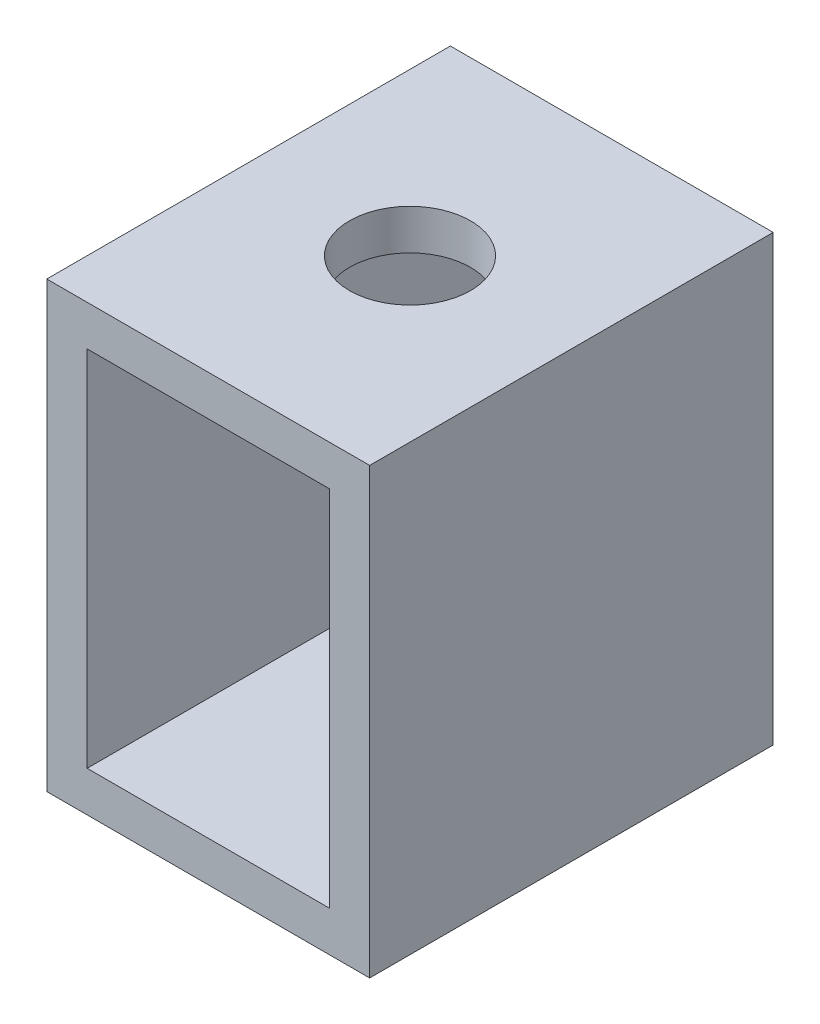
ISO-10303-21;
HEADER;
FILE_DESCRIPTION(('STEP AP214'),'2;1');
FILE_NAME('part.step','',(''),(''),'','','');
FILE_SCHEMA(('AUTOMOTIVE_DESIGN { 1 0 10303 214 1 1 1 1 }'));
ENDSEC;
DATA;
#1=APPLICATION_CONTEXT('core data for automotive mechanical design processes');
#2=APPLICATION_PROTOCOL_DEFINITION('international standard','automotive_design',2000,#1);
#3=PRODUCT_CONTEXT('',#1,'mechanical');
#4=PRODUCT('Part','Part','',(#3));
#5=PRODUCT_RELATED_PRODUCT_CATEGORY('part','',(#4));
#6=PRODUCT_DEFINITION_FORMATION('','',#4);
#7=PRODUCT_DEFINITION_CONTEXT('part definition',#1,'design');
#8=PRODUCT_DEFINITION('design','',#6,#7);
#9=PRODUCT_DEFINITION_SHAPE('','',#8);
#10=(LENGTH_UNIT() NAMED_UNIT(*) SI_UNIT(.MILLI.,.METRE.));
#11=(NAMED_UNIT(*) PLANE_ANGLE_UNIT() SI_UNIT($,.RADIAN.));
#12=(NAMED_UNIT(*) SI_UNIT($,.STERADIAN.) SOLID_ANGLE_UNIT());
#13=UNCERTAINTY_MEASURE_WITH_UNIT(LENGTH_MEASURE(1.E-05),#10,'distance_accuracy_value','');
#14=(GEOMETRIC_REPRESENTATION_CONTEXT(3) GLOBAL_UNCERTAINTY_ASSIGNED_CONTEXT((#13)) GLOBAL_UNIT_ASSIGNED_CONTEXT((#10,
#11,#12)) REPRESENTATION_CONTEXT('',''));
#15=CARTESIAN_POINT('',(0.,0.,0.));
#16=DIRECTION('',(0.,0.,1.));
#17=DIRECTION('',(1.,0.,0.));
#18=AXIS2_PLACEMENT_3D('',#15,#16,#17);
#19=CARTESIAN_POINT('',(0.,0.,5.));
#20=DIRECTION('',(0.,0.,1.));
#21=DIRECTION('',(1.,0.,0.));
#22=AXIS2_PLACEMENT_3D('',#19,#20,#21);
#23=PLANE('',#22);
#24=DIRECTION('',(0.,-1.,0.));
#25=VECTOR('',#24,1.);
#26=CARTESIAN_POINT('',(-0.5,0.,5.));
#27=LINE('',#26,#25);
#28=CARTESIAN_POINT('',(-0.5,5.,5.));
#29=VERTEX_POINT('',#28);
#30=CARTESIAN_POINT('',(-0.5,-0.5,5.));
#31=VERTEX_POINT('',#30);
#32=EDGE_CURVE('E159',#29,#31,#27,.T.);
#33=ORIENTED_EDGE('',*,*,#32,.T.);
#34=DIRECTION('',(1.,0.,0.));
#35=VECTOR('',#34,1.);
#36=CARTESIAN_POINT('',(0.,-0.5,5.));
#37=LINE('',#36,#35);
#38=CARTESIAN_POINT('',(3.5,-0.5,5.));
#39=VERTEX_POINT('',#38);
#40=EDGE_CURVE('E162',#31,#39,#37,.T.);
#41=ORIENTED_EDGE('',*,*,#40,.T.);
#42=DIRECTION('',(0.,1.,0.));
#43=VECTOR('',#42,1.);
#44=CARTESIAN_POINT('',(3.5,0.,5.));
#45=LINE('',#44,#43);
#46=CARTESIAN_POINT('',(3.5,5.,5.));
#47=VERTEX_POINT('',#46);
#48=EDGE_CURVE('E165',#39,#47,#45,.T.);
#49=ORIENTED_EDGE('',*,*,#48,.T.);
#50=DIRECTION('',(-1.,0.,0.));
#51=VECTOR('',#50,1.);
#52=CARTESIAN_POINT('',(0.,5.,5.));
#53=LINE('',#52,#51);
#54=EDGE_CURVE('E167',#47,#29,#53,.T.);
#55=ORIENTED_EDGE('',*,*,#54,.T.);
#56=EDGE_LOOP('',(#33,#41,#49,#55));
#57=FACE_BOUND('',#56,.T.);
#58=DIRECTION('',(1.,0.,0.));
#59=VECTOR('',#58,1.);
#60=CARTESIAN_POINT('',(0.,0.,5.));
#61=LINE('',#60,#59);
#62=CARTESIAN_POINT('',(0.,0.,5.));
#63=VERTEX_POINT('',#62);
#64=CARTESIAN_POINT('',(3.,0.,5.));
#65=VERTEX_POINT('',#64);
#66=EDGE_CURVE('E129',#63,#65,#61,.T.);
#67=ORIENTED_EDGE('',*,*,#66,.F.);
#68=DIRECTION('',(0.,-1.,0.));
#69=VECTOR('',#68,1.);
#70=CARTESIAN_POINT('',(0.,0.,5.));
#71=LINE('',#70,#69);
#72=CARTESIAN_POINT('',(0.,4.5,5.));
#73=VERTEX_POINT('',#72);
#74=EDGE_CURVE('E121',#73,#63,#71,.T.);
#75=ORIENTED_EDGE('',*,*,#74,.F.);
#76=DIRECTION('',(-1.,0.,0.));
#77=VECTOR('',#76,1.);
#78=CARTESIAN_POINT('',(0.,4.5,5.));
#79=LINE('',#78,#77);
#80=CARTESIAN_POINT('',(3.,4.5,5.));
#81=VERTEX_POINT('',#80);
#82=EDGE_CURVE('E143',#81,#73,#79,.T.);
#83=ORIENTED_EDGE('',*,*,#82,.F.);
#84=DIRECTION('',(0.,1.,0.));
#85=VECTOR('',#84,1.);
#86=CARTESIAN_POINT('',(3.,0.,5.));
#87=LINE('',#86,#85);
#88=EDGE_CURVE('E141',#65,#81,#87,.T.);
#89=ORIENTED_EDGE('',*,*,#88,.F.);
#90=EDGE_LOOP('',(#67,#75,#83,#89));
#91=FACE_BOUND('',#90,.T.);
#92=ADVANCED_FACE('F56',(#57,#91),#23,.T.);
#93=CARTESIAN_POINT('',(0.,0.,0.));
#94=DIRECTION('',(0.,0.,1.));
#95=DIRECTION('',(1.,0.,0.));
#96=AXIS2_PLACEMENT_3D('',#93,#94,#95);
#97=PLANE('',#96);
#98=DIRECTION('',(0.,-1.,0.));
#99=VECTOR('',#98,1.);
#100=CARTESIAN_POINT('',(-0.5,0.,0.));
#101=LINE('',#100,#99);
#102=CARTESIAN_POINT('',(-0.5,5.,0.));
#103=VERTEX_POINT('',#102);
#104=CARTESIAN_POINT('',(-0.5,-0.5,0.));
#105=VERTEX_POINT('',#104);
#106=EDGE_CURVE('E137',#103,#105,#101,.T.);
#107=ORIENTED_EDGE('',*,*,#106,.F.);
#108=DIRECTION('',(-1.,0.,0.));
#109=VECTOR('',#108,1.);
#110=CARTESIAN_POINT('',(0.,5.,0.));
#111=LINE('',#110,#109);
#112=CARTESIAN_POINT('',(3.5,5.,0.));
#113=VERTEX_POINT('',#112);
#114=EDGE_CURVE('E163',#113,#103,#111,.T.);
#115=ORIENTED_EDGE('',*,*,#114,.F.);
#116=DIRECTION('',(0.,1.,0.));
#117=VECTOR('',#116,1.);
#118=CARTESIAN_POINT('',(3.5,0.,0.));
#119=LINE('',#118,#117);
#120=CARTESIAN_POINT('',(3.5,-0.5,0.));
#121=VERTEX_POINT('',#120);
#122=EDGE_CURVE('E174',#121,#113,#119,.T.);
#123=ORIENTED_EDGE('',*,*,#122,.F.);
#124=DIRECTION('',(1.,0.,0.));
#125=VECTOR('',#124,1.);
#126=CARTESIAN_POINT('',(0.,-0.5,0.));
#127=LINE('',#126,#125);
#128=EDGE_CURVE('E172',#105,#121,#127,.T.);
#129=ORIENTED_EDGE('',*,*,#128,.F.);
#130=EDGE_LOOP('',(#107,#115,#123,#129));
#131=FACE_BOUND('',#130,.T.);
#132=DIRECTION('',(0.,-1.,0.));
#133=VECTOR('',#132,1.);
#134=CARTESIAN_POINT('',(0.,0.,0.));
#135=LINE('',#134,#133);
#136=CARTESIAN_POINT('',(0.,4.5,0.));
#137=VERTEX_POINT('',#136);
#138=CARTESIAN_POINT('',(0.,0.,0.));
#139=VERTEX_POINT('',#138);
#140=EDGE_CURVE('E79',#137,#139,#135,.T.);
#141=ORIENTED_EDGE('',*,*,#140,.T.);
#142=DIRECTION('',(1.,0.,0.));
#143=VECTOR('',#142,1.);
#144=CARTESIAN_POINT('',(0.,0.,0.));
#145=LINE('',#144,#143);
#146=CARTESIAN_POINT('',(3.,0.,0.));
#147=VERTEX_POINT('',#146);
#148=EDGE_CURVE('E136',#139,#147,#145,.T.);
#149=ORIENTED_EDGE('',*,*,#148,.T.);
#150=DIRECTION('',(0.,1.,0.));
#151=VECTOR('',#150,1.);
#152=CARTESIAN_POINT('',(3.,0.,0.));
#153=LINE('',#152,#151);
#154=CARTESIAN_POINT('',(3.,4.5,0.));
#155=VERTEX_POINT('',#154);
#156=EDGE_CURVE('E151',#147,#155,#153,.T.);
#157=ORIENTED_EDGE('',*,*,#156,.T.);
#158=DIRECTION('',(-1.,0.,0.));
#159=VECTOR('',#158,1.);
#160=CARTESIAN_POINT('',(0.,4.5,0.));
#161=LINE('',#160,#159);
#162=EDGE_CURVE('E130',#155,#137,#161,.T.);
#163=ORIENTED_EDGE('',*,*,#162,.T.);
#164=EDGE_LOOP('',(#141,#149,#157,#163));
#165=FACE_BOUND('',#164,.T.);
#166=ADVANCED_FACE('F192',(#131,#165),#97,.F.);
#167=CARTESIAN_POINT('',(-0.5,0.,5.));
#168=DIRECTION('',(1.,0.,0.));
#169=DIRECTION('',(0.,0.,-1.));
#170=AXIS2_PLACEMENT_3D('',#167,#168,#169);
#171=PLANE('',#170);
#172=ORIENTED_EDGE('',*,*,#106,.T.);
#173=DIRECTION('',(0.,0.,-1.));
#174=VECTOR('',#173,1.);
#175=CARTESIAN_POINT('',(-0.5,-0.5,5.));
#176=LINE('',#175,#174);
#177=EDGE_CURVE('E12',#31,#105,#176,.T.);
#178=ORIENTED_EDGE('',*,*,#177,.F.);
#179=ORIENTED_EDGE('',*,*,#32,.F.);
#180=DIRECTION('',(0.,0.,-1.));
#181=VECTOR('',#180,1.);
#182=CARTESIAN_POINT('',(-0.5,5.,5.));
#183=LINE('',#182,#181);
#184=EDGE_CURVE('E169',#29,#103,#183,.T.);
#185=ORIENTED_EDGE('',*,*,#184,.T.);
#186=EDGE_LOOP('',(#172,#178,#179,#185));
#187=FACE_BOUND('',#186,.T.);
#188=ADVANCED_FACE('F58',(#187),#171,.F.);
#189=CARTESIAN_POINT('',(0.,-0.5,5.));
#190=DIRECTION('',(0.,1.,0.));
#191=DIRECTION('',(0.,0.,1.));
#192=AXIS2_PLACEMENT_3D('',#189,#190,#191);
#193=PLANE('',#192);
#194=ORIENTED_EDGE('',*,*,#128,.T.);
#195=DIRECTION('',(0.,0.,-1.));
#196=VECTOR('',#195,1.);
#197=CARTESIAN_POINT('',(3.5,-0.5,5.));
#198=LINE('',#197,#196);
#199=EDGE_CURVE('E64',#39,#121,#198,.T.);
#200=ORIENTED_EDGE('',*,*,#199,.F.);
#201=ORIENTED_EDGE('',*,*,#40,.F.);
#202=ORIENTED_EDGE('',*,*,#177,.T.);
#203=EDGE_LOOP('',(#194,#200,#201,#202));
#204=FACE_BOUND('',#203,.T.);
#205=ADVANCED_FACE('F202',(#204),#193,.F.);
#206=CARTESIAN_POINT('',(3.5,0.,5.));
#207=DIRECTION('',(-1.,0.,0.));
#208=DIRECTION('',(0.,0.,1.));
#209=AXIS2_PLACEMENT_3D('',#206,#207,#208);
#210=PLANE('',#209);
#211=ORIENTED_EDGE('',*,*,#122,.T.);
#212=DIRECTION('',(0.,0.,-1.));
#213=VECTOR('',#212,1.);
#214=CARTESIAN_POINT('',(3.5,5.,5.));
#215=LINE('',#214,#213);
#216=EDGE_CURVE('E179',#47,#113,#215,.T.);
#217=ORIENTED_EDGE('',*,*,#216,.F.);
#218=ORIENTED_EDGE('',*,*,#48,.F.);
#219=ORIENTED_EDGE('',*,*,#199,.T.);
#220=EDGE_LOOP('',(#211,#217,#218,#219));
#221=FACE_BOUND('',#220,.T.);
#222=ADVANCED_FACE('F186',(#221),#210,.F.);
#223=CARTESIAN_POINT('',(0.,5.,5.));
#224=DIRECTION('',(0.,-1.,0.));
#225=DIRECTION('',(0.,0.,-1.));
#226=AXIS2_PLACEMENT_3D('',#223,#224,#225);
#227=PLANE('',#226);
#228=CARTESIAN_POINT('',(1.5,5.,2.5));
#229=DIRECTION('',(0.,1.,0.));
#230=DIRECTION('',(0.,0.,1.));
#231=AXIS2_PLACEMENT_3D('',#228,#229,#230);
#232=CIRCLE('',#231,0.75);
#233=CARTESIAN_POINT('',(1.5,5.,3.25));
#234=VERTEX_POINT('',#233);
#235=EDGE_CURVE('E149',#234,#234,#232,.T.);
#236=ORIENTED_EDGE('',*,*,#235,.F.);
#237=EDGE_LOOP('',(#236));
#238=FACE_BOUND('',#237,.T.);
#239=ORIENTED_EDGE('',*,*,#114,.T.);
#240=ORIENTED_EDGE('',*,*,#184,.F.);
#241=ORIENTED_EDGE('',*,*,#54,.F.);
#242=ORIENTED_EDGE('',*,*,#216,.T.);
#243=EDGE_LOOP('',(#239,#240,#241,#242));
#244=FACE_BOUND('',#243,.T.);
#245=ADVANCED_FACE('F196',(#238,#244),#227,.F.);
#246=CARTESIAN_POINT('',(0.,0.,5.));
#247=DIRECTION('',(1.,0.,0.));
#248=DIRECTION('',(0.,0.,-1.));
#249=AXIS2_PLACEMENT_3D('',#246,#247,#248);
#250=PLANE('',#249);
#251=ORIENTED_EDGE('',*,*,#140,.F.);
#252=DIRECTION('',(0.,0.,-1.));
#253=VECTOR('',#252,1.);
#254=CARTESIAN_POINT('',(0.,4.5,5.));
#255=LINE('',#254,#253);
#256=EDGE_CURVE('E125',#73,#137,#255,.T.);
#257=ORIENTED_EDGE('',*,*,#256,.F.);
#258=ORIENTED_EDGE('',*,*,#74,.T.);
#259=DIRECTION('',(0.,0.,-1.));
#260=VECTOR('',#259,1.);
#261=CARTESIAN_POINT('',(0.,0.,5.));
#262=LINE('',#261,#260);
#263=EDGE_CURVE('E124',#63,#139,#262,.T.);
#264=ORIENTED_EDGE('',*,*,#263,.T.);
#265=EDGE_LOOP('',(#251,#257,#258,#264));
#266=FACE_BOUND('',#265,.T.);
#267=ADVANCED_FACE('F123',(#266),#250,.T.);
#268=CARTESIAN_POINT('',(0.,0.,5.));
#269=DIRECTION('',(0.,1.,0.));
#270=DIRECTION('',(0.,0.,1.));
#271=AXIS2_PLACEMENT_3D('',#268,#269,#270);
#272=PLANE('',#271);
#273=ORIENTED_EDGE('',*,*,#148,.F.);
#274=ORIENTED_EDGE('',*,*,#263,.F.);
#275=ORIENTED_EDGE('',*,*,#66,.T.);
#276=DIRECTION('',(0.,0.,-1.));
#277=VECTOR('',#276,1.);
#278=CARTESIAN_POINT('',(3.,0.,5.));
#279=LINE('',#278,#277);
#280=EDGE_CURVE('E138',#65,#147,#279,.T.);
#281=ORIENTED_EDGE('',*,*,#280,.T.);
#282=EDGE_LOOP('',(#273,#274,#275,#281));
#283=FACE_BOUND('',#282,.T.);
#284=ADVANCED_FACE('F133',(#283),#272,.T.);
#285=CARTESIAN_POINT('',(3.,0.,5.));
#286=DIRECTION('',(-1.,0.,0.));
#287=DIRECTION('',(0.,0.,1.));
#288=AXIS2_PLACEMENT_3D('',#285,#286,#287);
#289=PLANE('',#288);
#290=ORIENTED_EDGE('',*,*,#156,.F.);
#291=ORIENTED_EDGE('',*,*,#280,.F.);
#292=ORIENTED_EDGE('',*,*,#88,.T.);
#293=DIRECTION('',(0.,0.,-1.));
#294=VECTOR('',#293,1.);
#295=CARTESIAN_POINT('',(3.,4.5,5.));
#296=LINE('',#295,#294);
#297=EDGE_CURVE('E71',#81,#155,#296,.T.);
#298=ORIENTED_EDGE('',*,*,#297,.T.);
#299=EDGE_LOOP('',(#290,#291,#292,#298));
#300=FACE_BOUND('',#299,.T.);
#301=ADVANCED_FACE('F239',(#300),#289,.T.);
#302=CARTESIAN_POINT('',(0.,4.5,5.));
#303=DIRECTION('',(0.,-1.,0.));
#304=DIRECTION('',(0.,0.,-1.));
#305=AXIS2_PLACEMENT_3D('',#302,#303,#304);
#306=PLANE('',#305);
#307=CARTESIAN_POINT('',(1.5,4.5,2.5));
#308=DIRECTION('',(0.,-1.,0.));
#309=DIRECTION('',(0.,0.,-1.));
#310=AXIS2_PLACEMENT_3D('',#307,#308,#309);
#311=CIRCLE('',#310,0.75);
#312=CARTESIAN_POINT('',(1.5,4.5,3.25));
#313=VERTEX_POINT('',#312);
#314=EDGE_CURVE('E226',#313,#313,#311,.F.);
#315=ORIENTED_EDGE('',*,*,#314,.T.);
#316=EDGE_LOOP('',(#315));
#317=FACE_BOUND('',#316,.T.);
#318=ORIENTED_EDGE('',*,*,#162,.F.);
#319=ORIENTED_EDGE('',*,*,#297,.F.);
#320=ORIENTED_EDGE('',*,*,#82,.T.);
#321=ORIENTED_EDGE('',*,*,#256,.T.);
#322=EDGE_LOOP('',(#318,#319,#320,#321));
#323=FACE_BOUND('',#322,.T.);
#324=ADVANCED_FACE('F231',(#317,#323),#306,.T.);
#325=CARTESIAN_POINT('',(1.5,-0.501,2.5));
#326=DIRECTION('',(0.,1.,0.));
#327=DIRECTION('',(0.,0.,1.));
#328=AXIS2_PLACEMENT_3D('',#325,#326,#327);
#329=CYLINDRICAL_SURFACE('',#328,0.75);
#330=CARTESIAN_POINT('',(1.5,4.5,3.25));
#331=CARTESIAN_POINT('',(1.5,4.50520833333333,3.25));
#332=CARTESIAN_POINT('',(1.5,4.51041666666667,3.25));
#333=CARTESIAN_POINT('',(1.5,4.52083333333333,3.25));
#334=CARTESIAN_POINT('',(1.5,4.52604166666667,3.25));
#335=CARTESIAN_POINT('',(1.5,4.53645833333333,3.25));
#336=CARTESIAN_POINT('',(1.5,4.54166666666667,3.25));
#337=CARTESIAN_POINT('',(1.5,4.55208333333333,3.25));
#338=CARTESIAN_POINT('',(1.5,4.55729166666667,3.25));
#339=CARTESIAN_POINT('',(1.5,4.56770833333333,3.25));
#340=CARTESIAN_POINT('',(1.5,4.57291666666667,3.25));
#341=CARTESIAN_POINT('',(1.5,4.58333333333333,3.25));
#342=CARTESIAN_POINT('',(1.5,4.58854166666667,3.25));
#343=CARTESIAN_POINT('',(1.5,4.59895833333333,3.25));
#344=CARTESIAN_POINT('',(1.5,4.60416666666667,3.25));
#345=CARTESIAN_POINT('',(1.5,4.61458333333333,3.25));
#346=CARTESIAN_POINT('',(1.5,4.61979166666667,3.25));
#347=CARTESIAN_POINT('',(1.5,4.63020833333333,3.25));
#348=CARTESIAN_POINT('',(1.5,4.63541666666667,3.25));
#349=CARTESIAN_POINT('',(1.5,4.64583333333333,3.25));
#350=CARTESIAN_POINT('',(1.5,4.65104166666667,3.25));
#351=CARTESIAN_POINT('',(1.5,4.66145833333333,3.25));
#352=CARTESIAN_POINT('',(1.5,4.66666666666667,3.25));
#353=CARTESIAN_POINT('',(1.5,4.67708333333333,3.25));
#354=CARTESIAN_POINT('',(1.5,4.68229166666667,3.25));
#355=CARTESIAN_POINT('',(1.5,4.69270833333333,3.25));
#356=CARTESIAN_POINT('',(1.5,4.69791666666667,3.25));
#357=CARTESIAN_POINT('',(1.5,4.70833333333333,3.25));
#358=CARTESIAN_POINT('',(1.5,4.71354166666667,3.25));
#359=CARTESIAN_POINT('',(1.5,4.72395833333333,3.25));
#360=CARTESIAN_POINT('',(1.5,4.72916666666667,3.25));
#361=CARTESIAN_POINT('',(1.5,4.73958333333333,3.25));
#362=CARTESIAN_POINT('',(1.5,4.74479166666667,3.25));
#363=CARTESIAN_POINT('',(1.5,4.75520833333333,3.25));
#364=CARTESIAN_POINT('',(1.5,4.76041666666667,3.25));
#365=CARTESIAN_POINT('',(1.5,4.77083333333333,3.25));
#366=CARTESIAN_POINT('',(1.5,4.77604166666667,3.25));
#367=CARTESIAN_POINT('',(1.5,4.78645833333333,3.25));
#368=CARTESIAN_POINT('',(1.5,4.79166666666667,3.25));
#369=CARTESIAN_POINT('',(1.5,4.80208333333333,3.25));
#370=CARTESIAN_POINT('',(1.5,4.80729166666667,3.25));
#371=CARTESIAN_POINT('',(1.5,4.81770833333333,3.25));
#372=CARTESIAN_POINT('',(1.5,4.82291666666667,3.25));
#373=CARTESIAN_POINT('',(1.5,4.83333333333333,3.25));
#374=CARTESIAN_POINT('',(1.5,4.83854166666667,3.25));
#375=CARTESIAN_POINT('',(1.5,4.84895833333333,3.25));
#376=CARTESIAN_POINT('',(1.5,4.85416666666667,3.25));
#377=CARTESIAN_POINT('',(1.5,4.86458333333333,3.25));
#378=CARTESIAN_POINT('',(1.5,4.86979166666667,3.25));
#379=CARTESIAN_POINT('',(1.5,4.88020833333333,3.25));
#380=CARTESIAN_POINT('',(1.5,4.88541666666666,3.25));
#381=CARTESIAN_POINT('',(1.5,4.89583333333333,3.25));
#382=CARTESIAN_POINT('',(1.5,4.90104166666666,3.25));
#383=CARTESIAN_POINT('',(1.5,4.91145833333333,3.25));
#384=CARTESIAN_POINT('',(1.5,4.91666666666666,3.25));
#385=CARTESIAN_POINT('',(1.5,4.92708333333333,3.25));
#386=CARTESIAN_POINT('',(1.5,4.93229166666666,3.25));
#387=CARTESIAN_POINT('',(1.5,4.94270833333333,3.25));
#388=CARTESIAN_POINT('',(1.5,4.94791666666666,3.25));
#389=CARTESIAN_POINT('',(1.5,4.95833333333333,3.25));
#390=CARTESIAN_POINT('',(1.5,4.96354166666666,3.25));
#391=CARTESIAN_POINT('',(1.5,4.97395833333333,3.25));
#392=CARTESIAN_POINT('',(1.5,4.97916666666666,3.25));
#393=CARTESIAN_POINT('',(1.5,4.98958333333333,3.25));
#394=CARTESIAN_POINT('',(1.5,4.99479166666666,3.25));
#395=CARTESIAN_POINT('',(1.5,5.,3.25));
#396=B_SPLINE_CURVE_WITH_KNOTS('',3,(#330,#331,#332,#333,#334,#335,#336,#337,#338,#339,#340,
#341,#342,#343,#344,#345,#346,#347,#348,#349,#350,#351,#352,#353,#354,#355,#356,#357,#358,#359,
#360,#361,#362,#363,#364,#365,#366,#367,#368,#369,#370,#371,#372,#373,#374,#375,#376,#377,#378,
#379,#380,#381,#382,#383,#384,#385,#386,#387,#388,#389,#390,#391,#392,#393,#394,#395),
.UNSPECIFIED.,.F.,.F.,(4,2,2,2,2,2,2,2,2,2,2,2,2,2,2,2,2,2,2,2,2,2,2,2,2,2,2,2,2,2,2,2,4),(0.,
0.015625,0.03125,0.046875,0.0625000000000001,0.0781250000000001,0.0937500000000001,0.109375,
0.125,0.140624999999999,0.156249999999999,0.171874999999999,0.187499999999999,0.203124999999999,
0.218749999999999,0.234374999999999,0.249999999999999,0.265624999999999,0.281249999999999,
0.296874999999999,0.312499999999999,0.328124999999999,0.343749999999999,0.359374999999999,
0.374999999999999,0.390624999999999,0.406249999999999,0.421874999999999,0.437499999999999,
0.453124999999999,0.468749999999999,0.484374999999999,0.499999999999999),.UNSPECIFIED.);
#397=EDGE_CURVE('BSEAM233',#313,#234,#396,.T.);
#398=ORIENTED_EDGE('',*,*,#314,.F.);
#399=ORIENTED_EDGE('',*,*,#235,.T.);
#400=ORIENTED_EDGE('',*,*,#397,.T.);
#401=ORIENTED_EDGE('',*,*,#397,.F.);
#402=EDGE_LOOP('',(#398,#400,#399,#401));
#403=FACE_BOUND('',#402,.T.);
#404=ADVANCED_FACE('F233',(#403),#329,.F.);
#405=CLOSED_SHELL('',(#92,#166,#188,#205,#222,#245,#267,#284,#301,#324,#404));
#406=MANIFOLD_SOLID_BREP('B2',#405);
#407=ADVANCED_BREP_SHAPE_REPRESENTATION('',(#18,#406),#14);
#408=SHAPE_DEFINITION_REPRESENTATION(#9,#407);
ENDSEC;
END-ISO-10303-21;
